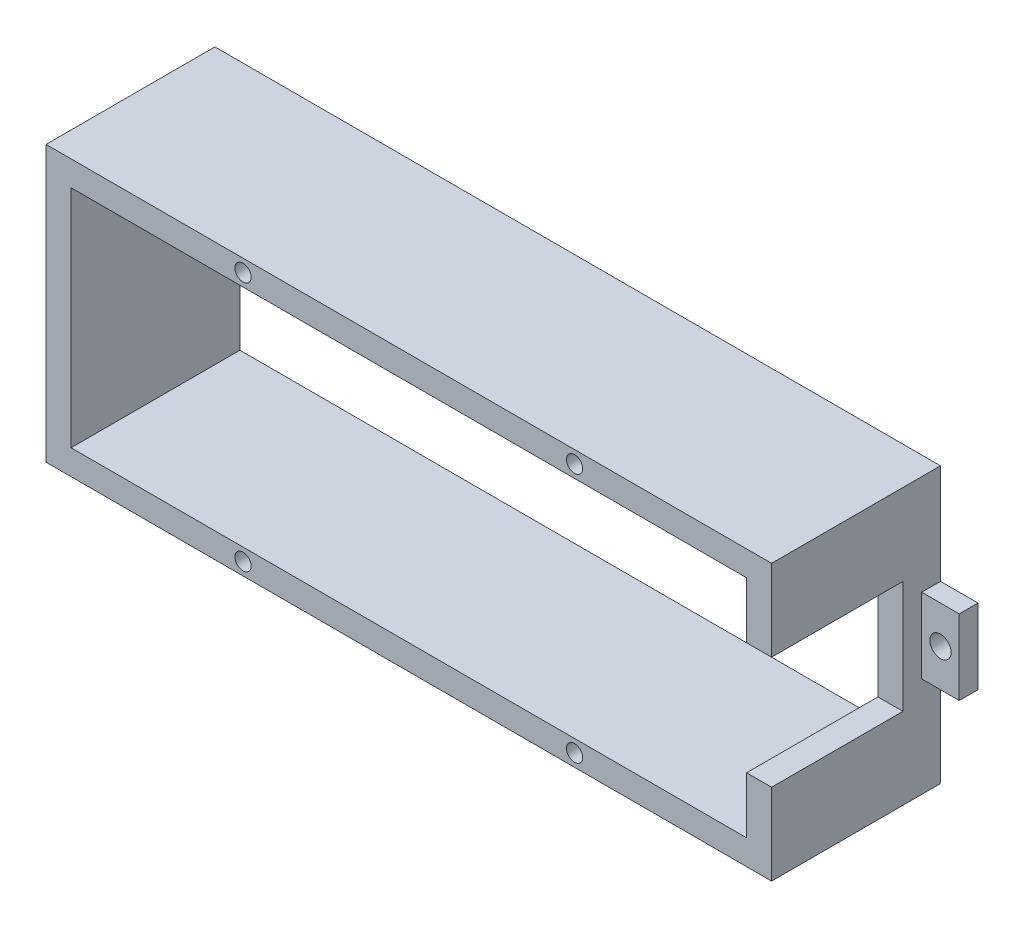
ISO-10303-21;
HEADER;
FILE_DESCRIPTION(('STEP AP214'),'2;1');
FILE_NAME('part.step','',(''),(''),'','','');
FILE_SCHEMA(('AUTOMOTIVE_DESIGN { 1 0 10303 214 1 1 1 1 }'));
ENDSEC;
DATA;
#1=APPLICATION_CONTEXT('core data for automotive mechanical design processes');
#2=APPLICATION_PROTOCOL_DEFINITION('international standard','automotive_design',2000,#1);
#3=PRODUCT_CONTEXT('',#1,'mechanical');
#4=PRODUCT('Part','Part','',(#3));
#5=PRODUCT_RELATED_PRODUCT_CATEGORY('part','',(#4));
#6=PRODUCT_DEFINITION_FORMATION('','',#4);
#7=PRODUCT_DEFINITION_CONTEXT('part definition',#1,'design');
#8=PRODUCT_DEFINITION('design','',#6,#7);
#9=PRODUCT_DEFINITION_SHAPE('','',#8);
#10=(LENGTH_UNIT() NAMED_UNIT(*) SI_UNIT(.MILLI.,.METRE.));
#11=(NAMED_UNIT(*) PLANE_ANGLE_UNIT() SI_UNIT($,.RADIAN.));
#12=(NAMED_UNIT(*) SI_UNIT($,.STERADIAN.) SOLID_ANGLE_UNIT());
#13=UNCERTAINTY_MEASURE_WITH_UNIT(LENGTH_MEASURE(1.E-05),#10,'distance_accuracy_value','');
#14=(GEOMETRIC_REPRESENTATION_CONTEXT(3) GLOBAL_UNCERTAINTY_ASSIGNED_CONTEXT((#13)) GLOBAL_UNIT_ASSIGNED_CONTEXT((#10,
#11,#12)) REPRESENTATION_CONTEXT('',''));
#15=CARTESIAN_POINT('',(0.,0.,0.));
#16=DIRECTION('',(0.,0.,1.));
#17=DIRECTION('',(1.,0.,0.));
#18=AXIS2_PLACEMENT_3D('',#15,#16,#17);
#19=CARTESIAN_POINT('',(58.,20.,87.));
#20=DIRECTION('',(-1.,0.,0.));
#21=DIRECTION('',(0.,0.,1.));
#22=AXIS2_PLACEMENT_3D('',#19,#20,#21);
#23=PLANE('',#22);
#24=DIRECTION('',(0.,0.,-1.));
#25=VECTOR('',#24,1.);
#26=CARTESIAN_POINT('',(58.,33.,87.));
#27=LINE('',#26,#25);
#28=CARTESIAN_POINT('',(58.,33.,87.));
#29=VERTEX_POINT('',#28);
#30=CARTESIAN_POINT('',(58.,33.,66.));
#31=VERTEX_POINT('',#30);
#32=EDGE_CURVE('E201',#29,#31,#27,.T.);
#33=ORIENTED_EDGE('',*,*,#32,.F.);
#34=DIRECTION('',(0.,1.,0.));
#35=VECTOR('',#34,1.);
#36=CARTESIAN_POINT('',(58.,20.,87.));
#37=LINE('',#36,#35);
#38=CARTESIAN_POINT('',(58.,20.,87.));
#39=VERTEX_POINT('',#38);
#40=EDGE_CURVE('E316',#39,#29,#37,.T.);
#41=ORIENTED_EDGE('',*,*,#40,.F.);
#42=DIRECTION('',(0.,0.,-1.));
#43=VECTOR('',#42,1.);
#44=CARTESIAN_POINT('',(58.,20.,87.));
#45=LINE('',#44,#43);
#46=CARTESIAN_POINT('',(58.,20.,60.));
#47=VERTEX_POINT('',#46);
#48=EDGE_CURVE('E339',#39,#47,#45,.T.);
#49=ORIENTED_EDGE('',*,*,#48,.T.);
#50=DIRECTION('',(0.,1.,0.));
#51=VECTOR('',#50,1.);
#52=CARTESIAN_POINT('',(58.,20.,60.));
#53=LINE('',#52,#51);
#54=CARTESIAN_POINT('',(58.,36.,60.));
#55=VERTEX_POINT('',#54);
#56=EDGE_CURVE('E327',#47,#55,#53,.T.);
#57=ORIENTED_EDGE('',*,*,#56,.T.);
#58=DIRECTION('',(0.,0.,-1.));
#59=VECTOR('',#58,1.);
#60=CARTESIAN_POINT('',(58.,36.,63.));
#61=LINE('',#60,#59);
#62=CARTESIAN_POINT('',(58.,36.,63.));
#63=VERTEX_POINT('',#62);
#64=EDGE_CURVE('E252',#63,#55,#61,.T.);
#65=ORIENTED_EDGE('',*,*,#64,.F.);
#66=DIRECTION('',(0.,-1.,0.));
#67=VECTOR('',#66,1.);
#68=CARTESIAN_POINT('',(58.,48.,63.));
#69=LINE('',#68,#67);
#70=CARTESIAN_POINT('',(58.,48.,63.));
#71=VERTEX_POINT('',#70);
#72=EDGE_CURVE('E229',#71,#63,#69,.T.);
#73=ORIENTED_EDGE('',*,*,#72,.F.);
#74=DIRECTION('',(0.,0.,-1.));
#75=VECTOR('',#74,1.);
#76=CARTESIAN_POINT('',(58.,48.,63.));
#77=LINE('',#76,#75);
#78=CARTESIAN_POINT('',(58.,48.,60.));
#79=VERTEX_POINT('',#78);
#80=EDGE_CURVE('E240',#71,#79,#77,.T.);
#81=ORIENTED_EDGE('',*,*,#80,.T.);
#82=CARTESIAN_POINT('',(58.,64.,60.));
#83=VERTEX_POINT('',#82);
#84=EDGE_CURVE('E330',#79,#83,#53,.T.);
#85=ORIENTED_EDGE('',*,*,#84,.T.);
#86=DIRECTION('',(0.,0.,-1.));
#87=VECTOR('',#86,1.);
#88=CARTESIAN_POINT('',(58.,64.,87.));
#89=LINE('',#88,#87);
#90=CARTESIAN_POINT('',(58.,64.,87.));
#91=VERTEX_POINT('',#90);
#92=EDGE_CURVE('E331',#91,#83,#89,.T.);
#93=ORIENTED_EDGE('',*,*,#92,.F.);
#94=CARTESIAN_POINT('',(58.,51.,87.));
#95=VERTEX_POINT('',#94);
#96=EDGE_CURVE('E198',#95,#91,#37,.T.);
#97=ORIENTED_EDGE('',*,*,#96,.F.);
#98=DIRECTION('',(0.,0.,1.));
#99=VECTOR('',#98,1.);
#100=CARTESIAN_POINT('',(58.,51.,87.));
#101=LINE('',#100,#99);
#102=CARTESIAN_POINT('',(58.,51.,66.));
#103=VERTEX_POINT('',#102);
#104=EDGE_CURVE('E190',#103,#95,#101,.T.);
#105=ORIENTED_EDGE('',*,*,#104,.F.);
#106=DIRECTION('',(0.,1.,0.));
#107=VECTOR('',#106,1.);
#108=CARTESIAN_POINT('',(58.,20.,66.));
#109=LINE('',#108,#107);
#110=EDGE_CURVE('E179',#31,#103,#109,.T.);
#111=ORIENTED_EDGE('',*,*,#110,.F.);
#112=EDGE_LOOP('',(#33,#41,#49,#57,#65,#73,#81,#85,#93,#97,#105,#111));
#113=FACE_BOUND('',#112,.T.);
#114=ADVANCED_FACE('F39',(#113),#23,.F.);
#115=CARTESIAN_POINT('',(0.,0.,87.));
#116=DIRECTION('',(0.,0.,1.));
#117=DIRECTION('',(1.,0.,0.));
#118=AXIS2_PLACEMENT_3D('',#115,#116,#117);
#119=PLANE('',#118);
#120=CARTESIAN_POINT('',(26.5,22.,87.));
#121=DIRECTION('',(0.,0.,1.));
#122=DIRECTION('',(1.,0.,0.));
#123=AXIS2_PLACEMENT_3D('',#120,#121,#122);
#124=CIRCLE('',#123,1.3);
#125=CARTESIAN_POINT('',(27.8,22.,87.));
#126=VERTEX_POINT('',#125);
#127=EDGE_CURVE('E345',#126,#126,#124,.F.);
#128=ORIENTED_EDGE('',*,*,#127,.T.);
#129=EDGE_LOOP('',(#128));
#130=FACE_BOUND('',#129,.T.);
#131=CARTESIAN_POINT('',(-26.5,62.,87.));
#132=DIRECTION('',(0.,0.,1.));
#133=DIRECTION('',(1.,0.,0.));
#134=AXIS2_PLACEMENT_3D('',#131,#132,#133);
#135=CIRCLE('',#134,1.3);
#136=CARTESIAN_POINT('',(-25.2,62.,87.));
#137=VERTEX_POINT('',#136);
#138=EDGE_CURVE('E352',#137,#137,#135,.F.);
#139=ORIENTED_EDGE('',*,*,#138,.T.);
#140=EDGE_LOOP('',(#139));
#141=FACE_BOUND('',#140,.T.);
#142=CARTESIAN_POINT('',(-26.5,22.,87.));
#143=DIRECTION('',(0.,0.,1.));
#144=DIRECTION('',(1.,0.,0.));
#145=AXIS2_PLACEMENT_3D('',#142,#143,#144);
#146=CIRCLE('',#145,1.3);
#147=CARTESIAN_POINT('',(-25.2,22.,87.));
#148=VERTEX_POINT('',#147);
#149=EDGE_CURVE('E348',#148,#148,#146,.F.);
#150=ORIENTED_EDGE('',*,*,#149,.T.);
#151=EDGE_LOOP('',(#150));
#152=FACE_BOUND('',#151,.T.);
#153=CARTESIAN_POINT('',(26.5,62.,87.));
#154=DIRECTION('',(0.,0.,1.));
#155=DIRECTION('',(1.,0.,0.));
#156=AXIS2_PLACEMENT_3D('',#153,#154,#155);
#157=CIRCLE('',#156,1.3);
#158=CARTESIAN_POINT('',(27.8,62.,87.));
#159=VERTEX_POINT('',#158);
#160=EDGE_CURVE('E220',#159,#159,#157,.F.);
#161=ORIENTED_EDGE('',*,*,#160,.T.);
#162=EDGE_LOOP('',(#161));
#163=FACE_BOUND('',#162,.T.);
#164=ORIENTED_EDGE('',*,*,#40,.T.);
#165=DIRECTION('',(-1.,0.,0.));
#166=VECTOR('',#165,1.);
#167=CARTESIAN_POINT('',(0.,33.,87.));
#168=LINE('',#167,#166);
#169=CARTESIAN_POINT('',(54.,33.,87.));
#170=VERTEX_POINT('',#169);
#171=EDGE_CURVE('E187',#29,#170,#168,.T.);
#172=ORIENTED_EDGE('',*,*,#171,.T.);
#173=DIRECTION('',(0.,1.,0.));
#174=VECTOR('',#173,1.);
#175=CARTESIAN_POINT('',(54.,24.,87.));
#176=LINE('',#175,#174);
#177=CARTESIAN_POINT('',(54.,24.,87.));
#178=VERTEX_POINT('',#177);
#179=EDGE_CURVE('E285',#178,#170,#176,.T.);
#180=ORIENTED_EDGE('',*,*,#179,.F.);
#181=DIRECTION('',(1.,0.,0.));
#182=VECTOR('',#181,1.);
#183=CARTESIAN_POINT('',(-54.,24.,87.));
#184=LINE('',#183,#182);
#185=CARTESIAN_POINT('',(-54.,24.,87.));
#186=VERTEX_POINT('',#185);
#187=EDGE_CURVE('E278',#186,#178,#184,.T.);
#188=ORIENTED_EDGE('',*,*,#187,.F.);
#189=DIRECTION('',(0.,-1.,0.));
#190=VECTOR('',#189,1.);
#191=CARTESIAN_POINT('',(-54.,60.,87.));
#192=LINE('',#191,#190);
#193=CARTESIAN_POINT('',(-54.,60.,87.));
#194=VERTEX_POINT('',#193);
#195=EDGE_CURVE('E279',#194,#186,#192,.T.);
#196=ORIENTED_EDGE('',*,*,#195,.F.);
#197=DIRECTION('',(-1.,0.,0.));
#198=VECTOR('',#197,1.);
#199=CARTESIAN_POINT('',(54.,60.,87.));
#200=LINE('',#199,#198);
#201=CARTESIAN_POINT('',(54.,60.,87.));
#202=VERTEX_POINT('',#201);
#203=EDGE_CURVE('E287',#202,#194,#200,.T.);
#204=ORIENTED_EDGE('',*,*,#203,.F.);
#205=CARTESIAN_POINT('',(54.,51.,87.));
#206=VERTEX_POINT('',#205);
#207=EDGE_CURVE('E282',#206,#202,#176,.T.);
#208=ORIENTED_EDGE('',*,*,#207,.F.);
#209=DIRECTION('',(1.,0.,0.));
#210=VECTOR('',#209,1.);
#211=CARTESIAN_POINT('',(0.,51.,87.));
#212=LINE('',#211,#210);
#213=EDGE_CURVE('E53',#206,#95,#212,.T.);
#214=ORIENTED_EDGE('',*,*,#213,.T.);
#215=ORIENTED_EDGE('',*,*,#96,.T.);
#216=DIRECTION('',(-1.,0.,0.));
#217=VECTOR('',#216,1.);
#218=CARTESIAN_POINT('',(58.,64.,87.));
#219=LINE('',#218,#217);
#220=CARTESIAN_POINT('',(-58.,64.,87.));
#221=VERTEX_POINT('',#220);
#222=EDGE_CURVE('E317',#91,#221,#219,.T.);
#223=ORIENTED_EDGE('',*,*,#222,.T.);
#224=DIRECTION('',(0.,-1.,0.));
#225=VECTOR('',#224,1.);
#226=CARTESIAN_POINT('',(-58.,64.,87.));
#227=LINE('',#226,#225);
#228=CARTESIAN_POINT('',(-58.,20.,87.));
#229=VERTEX_POINT('',#228);
#230=EDGE_CURVE('E309',#221,#229,#227,.T.);
#231=ORIENTED_EDGE('',*,*,#230,.T.);
#232=DIRECTION('',(1.,0.,0.));
#233=VECTOR('',#232,1.);
#234=CARTESIAN_POINT('',(-58.,20.,87.));
#235=LINE('',#234,#233);
#236=EDGE_CURVE('E311',#229,#39,#235,.T.);
#237=ORIENTED_EDGE('',*,*,#236,.T.);
#238=EDGE_LOOP('',(#164,#172,#180,#188,#196,#204,#208,#214,#215,#223,#231,#237));
#239=FACE_BOUND('',#238,.T.);
#240=ADVANCED_FACE('F364',(#130,#141,#152,#163,#239),#119,.T.);
#241=CARTESIAN_POINT('',(54.,24.,87.));
#242=DIRECTION('',(-1.,0.,0.));
#243=DIRECTION('',(0.,0.,1.));
#244=AXIS2_PLACEMENT_3D('',#241,#242,#243);
#245=PLANE('',#244);
#246=ORIENTED_EDGE('',*,*,#179,.T.);
#247=DIRECTION('',(0.,0.,-1.));
#248=VECTOR('',#247,1.);
#249=CARTESIAN_POINT('',(54.,33.,87.));
#250=LINE('',#249,#248);
#251=CARTESIAN_POINT('',(54.,33.,66.));
#252=VERTEX_POINT('',#251);
#253=EDGE_CURVE('E11',#170,#252,#250,.T.);
#254=ORIENTED_EDGE('',*,*,#253,.T.);
#255=DIRECTION('',(0.,1.,0.));
#256=VECTOR('',#255,1.);
#257=CARTESIAN_POINT('',(54.,24.,66.));
#258=LINE('',#257,#256);
#259=CARTESIAN_POINT('',(54.,51.,66.));
#260=VERTEX_POINT('',#259);
#261=EDGE_CURVE('E50',#252,#260,#258,.T.);
#262=ORIENTED_EDGE('',*,*,#261,.T.);
#263=DIRECTION('',(0.,0.,1.));
#264=VECTOR('',#263,1.);
#265=CARTESIAN_POINT('',(54.,51.,87.));
#266=LINE('',#265,#264);
#267=EDGE_CURVE('E192',#260,#206,#266,.T.);
#268=ORIENTED_EDGE('',*,*,#267,.T.);
#269=ORIENTED_EDGE('',*,*,#207,.T.);
#270=DIRECTION('',(0.,0.,-1.));
#271=VECTOR('',#270,1.);
#272=CARTESIAN_POINT('',(54.,60.,87.));
#273=LINE('',#272,#271);
#274=CARTESIAN_POINT('',(54.,60.,60.));
#275=VERTEX_POINT('',#274);
#276=EDGE_CURVE('E302',#202,#275,#273,.T.);
#277=ORIENTED_EDGE('',*,*,#276,.T.);
#278=DIRECTION('',(0.,1.,0.));
#279=VECTOR('',#278,1.);
#280=CARTESIAN_POINT('',(54.,24.,60.));
#281=LINE('',#280,#279);
#282=CARTESIAN_POINT('',(54.,24.,60.));
#283=VERTEX_POINT('',#282);
#284=EDGE_CURVE('E293',#283,#275,#281,.T.);
#285=ORIENTED_EDGE('',*,*,#284,.F.);
#286=DIRECTION('',(0.,0.,-1.));
#287=VECTOR('',#286,1.);
#288=CARTESIAN_POINT('',(54.,24.,87.));
#289=LINE('',#288,#287);
#290=EDGE_CURVE('E303',#178,#283,#289,.T.);
#291=ORIENTED_EDGE('',*,*,#290,.F.);
#292=EDGE_LOOP('',(#246,#254,#262,#268,#269,#277,#285,#291));
#293=FACE_BOUND('',#292,.T.);
#294=ADVANCED_FACE('F358',(#293),#245,.T.);
#295=CARTESIAN_POINT('',(-58.,64.,87.));
#296=DIRECTION('',(1.,0.,0.));
#297=DIRECTION('',(0.,0.,-1.));
#298=AXIS2_PLACEMENT_3D('',#295,#296,#297);
#299=PLANE('',#298);
#300=DIRECTION('',(0.,0.,-1.));
#301=VECTOR('',#300,1.);
#302=CARTESIAN_POINT('',(-58.,48.,63.));
#303=LINE('',#302,#301);
#304=CARTESIAN_POINT('',(-58.,48.,63.));
#305=VERTEX_POINT('',#304);
#306=CARTESIAN_POINT('',(-58.,48.,60.));
#307=VERTEX_POINT('',#306);
#308=EDGE_CURVE('E259',#305,#307,#303,.T.);
#309=ORIENTED_EDGE('',*,*,#308,.F.);
#310=DIRECTION('',(0.,1.,0.));
#311=VECTOR('',#310,1.);
#312=CARTESIAN_POINT('',(-58.,36.,63.));
#313=LINE('',#312,#311);
#314=CARTESIAN_POINT('',(-58.,36.,63.));
#315=VERTEX_POINT('',#314);
#316=EDGE_CURVE('E275',#315,#305,#313,.T.);
#317=ORIENTED_EDGE('',*,*,#316,.F.);
#318=DIRECTION('',(0.,0.,-1.));
#319=VECTOR('',#318,1.);
#320=CARTESIAN_POINT('',(-58.,36.,63.));
#321=LINE('',#320,#319);
#322=CARTESIAN_POINT('',(-58.,36.,60.));
#323=VERTEX_POINT('',#322);
#324=EDGE_CURVE('E260',#315,#323,#321,.T.);
#325=ORIENTED_EDGE('',*,*,#324,.T.);
#326=DIRECTION('',(0.,-1.,0.));
#327=VECTOR('',#326,1.);
#328=CARTESIAN_POINT('',(-58.,64.,60.));
#329=LINE('',#328,#327);
#330=CARTESIAN_POINT('',(-58.,20.,60.));
#331=VERTEX_POINT('',#330);
#332=EDGE_CURVE('E310',#323,#331,#329,.T.);
#333=ORIENTED_EDGE('',*,*,#332,.T.);
#334=DIRECTION('',(0.,0.,-1.));
#335=VECTOR('',#334,1.);
#336=CARTESIAN_POINT('',(-58.,20.,87.));
#337=LINE('',#336,#335);
#338=EDGE_CURVE('E336',#229,#331,#337,.T.);
#339=ORIENTED_EDGE('',*,*,#338,.F.);
#340=ORIENTED_EDGE('',*,*,#230,.F.);
#341=DIRECTION('',(0.,0.,-1.));
#342=VECTOR('',#341,1.);
#343=CARTESIAN_POINT('',(-58.,64.,87.));
#344=LINE('',#343,#342);
#345=CARTESIAN_POINT('',(-58.,64.,60.));
#346=VERTEX_POINT('',#345);
#347=EDGE_CURVE('E321',#221,#346,#344,.T.);
#348=ORIENTED_EDGE('',*,*,#347,.T.);
#349=EDGE_CURVE('E325',#346,#307,#329,.T.);
#350=ORIENTED_EDGE('',*,*,#349,.T.);
#351=EDGE_LOOP('',(#309,#317,#325,#333,#339,#340,#348,#350));
#352=FACE_BOUND('',#351,.T.);
#353=ADVANCED_FACE('F41',(#352),#299,.F.);
#354=CARTESIAN_POINT('',(0.,0.,60.));
#355=DIRECTION('',(0.,0.,1.));
#356=DIRECTION('',(1.,0.,0.));
#357=AXIS2_PLACEMENT_3D('',#354,#355,#356);
#358=PLANE('',#357);
#359=CARTESIAN_POINT('',(61.,42.,60.));
#360=DIRECTION('',(0.,0.,1.));
#361=DIRECTION('',(1.,0.,0.));
#362=AXIS2_PLACEMENT_3D('',#359,#360,#361);
#363=CIRCLE('',#362,1.69999999999999);
#364=CARTESIAN_POINT('',(62.7,42.,60.));
#365=VERTEX_POINT('',#364);
#366=EDGE_CURVE('E224',#365,#365,#363,.F.);
#367=ORIENTED_EDGE('',*,*,#366,.F.);
#368=EDGE_LOOP('',(#367));
#369=FACE_BOUND('',#368,.T.);
#370=CARTESIAN_POINT('',(-61.,42.,60.));
#371=DIRECTION('',(0.,0.,1.));
#372=DIRECTION('',(1.,0.,0.));
#373=AXIS2_PLACEMENT_3D('',#370,#371,#372);
#374=CIRCLE('',#373,1.7);
#375=CARTESIAN_POINT('',(-59.3,42.,60.));
#376=VERTEX_POINT('',#375);
#377=EDGE_CURVE('E217',#376,#376,#374,.F.);
#378=ORIENTED_EDGE('',*,*,#377,.F.);
#379=EDGE_LOOP('',(#378));
#380=FACE_BOUND('',#379,.T.);
#381=ORIENTED_EDGE('',*,*,#349,.F.);
#382=DIRECTION('',(-1.,0.,0.));
#383=VECTOR('',#382,1.);
#384=CARTESIAN_POINT('',(58.,64.,60.));
#385=LINE('',#384,#383);
#386=EDGE_CURVE('E314',#83,#346,#385,.T.);
#387=ORIENTED_EDGE('',*,*,#386,.F.);
#388=ORIENTED_EDGE('',*,*,#84,.F.);
#389=DIRECTION('',(-1.,0.,0.));
#390=VECTOR('',#389,1.);
#391=CARTESIAN_POINT('',(64.,48.,60.));
#392=LINE('',#391,#390);
#393=CARTESIAN_POINT('',(64.,48.,60.));
#394=VERTEX_POINT('',#393);
#395=EDGE_CURVE('E231',#394,#79,#392,.T.);
#396=ORIENTED_EDGE('',*,*,#395,.F.);
#397=DIRECTION('',(0.,1.,0.));
#398=VECTOR('',#397,1.);
#399=CARTESIAN_POINT('',(64.,36.,60.));
#400=LINE('',#399,#398);
#401=CARTESIAN_POINT('',(64.,36.,60.));
#402=VERTEX_POINT('',#401);
#403=EDGE_CURVE('E238',#402,#394,#400,.T.);
#404=ORIENTED_EDGE('',*,*,#403,.F.);
#405=DIRECTION('',(1.,0.,0.));
#406=VECTOR('',#405,1.);
#407=CARTESIAN_POINT('',(58.,36.,60.));
#408=LINE('',#407,#406);
#409=EDGE_CURVE('E236',#55,#402,#408,.T.);
#410=ORIENTED_EDGE('',*,*,#409,.F.);
#411=ORIENTED_EDGE('',*,*,#56,.F.);
#412=DIRECTION('',(1.,0.,0.));
#413=VECTOR('',#412,1.);
#414=CARTESIAN_POINT('',(-58.,20.,60.));
#415=LINE('',#414,#413);
#416=EDGE_CURVE('E324',#331,#47,#415,.T.);
#417=ORIENTED_EDGE('',*,*,#416,.F.);
#418=ORIENTED_EDGE('',*,*,#332,.F.);
#419=DIRECTION('',(1.,0.,0.));
#420=VECTOR('',#419,1.);
#421=CARTESIAN_POINT('',(-64.,36.,60.));
#422=LINE('',#421,#420);
#423=CARTESIAN_POINT('',(-64.,36.,60.));
#424=VERTEX_POINT('',#423);
#425=EDGE_CURVE('E64',#424,#323,#422,.T.);
#426=ORIENTED_EDGE('',*,*,#425,.F.);
#427=DIRECTION('',(0.,-1.,0.));
#428=VECTOR('',#427,1.);
#429=CARTESIAN_POINT('',(-64.,48.,60.));
#430=LINE('',#429,#428);
#431=CARTESIAN_POINT('',(-64.,48.,60.));
#432=VERTEX_POINT('',#431);
#433=EDGE_CURVE('E243',#432,#424,#430,.T.);
#434=ORIENTED_EDGE('',*,*,#433,.F.);
#435=DIRECTION('',(-1.,0.,0.));
#436=VECTOR('',#435,1.);
#437=CARTESIAN_POINT('',(-58.,48.,60.));
#438=LINE('',#437,#436);
#439=EDGE_CURVE('E264',#307,#432,#438,.T.);
#440=ORIENTED_EDGE('',*,*,#439,.F.);
#441=EDGE_LOOP('',(#381,#387,#388,#396,#404,#410,#411,#417,#418,#426,#434,#440));
#442=FACE_BOUND('',#441,.T.);
#443=DIRECTION('',(0.,-1.,0.));
#444=VECTOR('',#443,1.);
#445=CARTESIAN_POINT('',(-54.,60.,60.));
#446=LINE('',#445,#444);
#447=CARTESIAN_POINT('',(-54.,60.,60.));
#448=VERTEX_POINT('',#447);
#449=CARTESIAN_POINT('',(-54.,24.,60.));
#450=VERTEX_POINT('',#449);
#451=EDGE_CURVE('E254',#448,#450,#446,.T.);
#452=ORIENTED_EDGE('',*,*,#451,.T.);
#453=DIRECTION('',(1.,0.,0.));
#454=VECTOR('',#453,1.);
#455=CARTESIAN_POINT('',(-54.,24.,60.));
#456=LINE('',#455,#454);
#457=EDGE_CURVE('E295',#450,#283,#456,.T.);
#458=ORIENTED_EDGE('',*,*,#457,.T.);
#459=ORIENTED_EDGE('',*,*,#284,.T.);
#460=DIRECTION('',(-1.,0.,0.));
#461=VECTOR('',#460,1.);
#462=CARTESIAN_POINT('',(54.,60.,60.));
#463=LINE('',#462,#461);
#464=EDGE_CURVE('E283',#275,#448,#463,.T.);
#465=ORIENTED_EDGE('',*,*,#464,.T.);
#466=EDGE_LOOP('',(#452,#458,#459,#465));
#467=FACE_BOUND('',#466,.T.);
#468=ADVANCED_FACE('F380',(#369,#380,#442,#467),#358,.F.);
#469=CARTESIAN_POINT('',(-58.,20.,87.));
#470=DIRECTION('',(0.,1.,0.));
#471=DIRECTION('',(0.,0.,1.));
#472=AXIS2_PLACEMENT_3D('',#469,#470,#471);
#473=PLANE('',#472);
#474=ORIENTED_EDGE('',*,*,#48,.F.);
#475=ORIENTED_EDGE('',*,*,#236,.F.);
#476=ORIENTED_EDGE('',*,*,#338,.T.);
#477=ORIENTED_EDGE('',*,*,#416,.T.);
#478=EDGE_LOOP('',(#474,#475,#476,#477));
#479=FACE_BOUND('',#478,.T.);
#480=ADVANCED_FACE('F371',(#479),#473,.F.);
#481=CARTESIAN_POINT('',(58.,64.,87.));
#482=DIRECTION('',(0.,-1.,0.));
#483=DIRECTION('',(0.,0.,-1.));
#484=AXIS2_PLACEMENT_3D('',#481,#482,#483);
#485=PLANE('',#484);
#486=ORIENTED_EDGE('',*,*,#347,.F.);
#487=ORIENTED_EDGE('',*,*,#222,.F.);
#488=ORIENTED_EDGE('',*,*,#92,.T.);
#489=ORIENTED_EDGE('',*,*,#386,.T.);
#490=EDGE_LOOP('',(#486,#487,#488,#489));
#491=FACE_BOUND('',#490,.T.);
#492=ADVANCED_FACE('F398',(#491),#485,.F.);
#493=CARTESIAN_POINT('',(-54.,60.,87.));
#494=DIRECTION('',(1.,0.,0.));
#495=DIRECTION('',(0.,0.,-1.));
#496=AXIS2_PLACEMENT_3D('',#493,#494,#495);
#497=PLANE('',#496);
#498=ORIENTED_EDGE('',*,*,#451,.F.);
#499=DIRECTION('',(0.,0.,-1.));
#500=VECTOR('',#499,1.);
#501=CARTESIAN_POINT('',(-54.,60.,87.));
#502=LINE('',#501,#500);
#503=EDGE_CURVE('E288',#194,#448,#502,.T.);
#504=ORIENTED_EDGE('',*,*,#503,.F.);
#505=ORIENTED_EDGE('',*,*,#195,.T.);
#506=DIRECTION('',(0.,0.,-1.));
#507=VECTOR('',#506,1.);
#508=CARTESIAN_POINT('',(-54.,24.,87.));
#509=LINE('',#508,#507);
#510=EDGE_CURVE('E308',#186,#450,#509,.T.);
#511=ORIENTED_EDGE('',*,*,#510,.T.);
#512=EDGE_LOOP('',(#498,#504,#505,#511));
#513=FACE_BOUND('',#512,.T.);
#514=ADVANCED_FACE('F413',(#513),#497,.T.);
#515=CARTESIAN_POINT('',(-54.,24.,87.));
#516=DIRECTION('',(0.,1.,0.));
#517=DIRECTION('',(0.,0.,1.));
#518=AXIS2_PLACEMENT_3D('',#515,#516,#517);
#519=PLANE('',#518);
#520=ORIENTED_EDGE('',*,*,#187,.T.);
#521=ORIENTED_EDGE('',*,*,#290,.T.);
#522=ORIENTED_EDGE('',*,*,#457,.F.);
#523=ORIENTED_EDGE('',*,*,#510,.F.);
#524=EDGE_LOOP('',(#520,#521,#522,#523));
#525=FACE_BOUND('',#524,.T.);
#526=ADVANCED_FACE('F412',(#525),#519,.T.);
#527=CARTESIAN_POINT('',(54.,60.,87.));
#528=DIRECTION('',(0.,-1.,0.));
#529=DIRECTION('',(0.,0.,-1.));
#530=AXIS2_PLACEMENT_3D('',#527,#528,#529);
#531=PLANE('',#530);
#532=ORIENTED_EDGE('',*,*,#203,.T.);
#533=ORIENTED_EDGE('',*,*,#503,.T.);
#534=ORIENTED_EDGE('',*,*,#464,.F.);
#535=ORIENTED_EDGE('',*,*,#276,.F.);
#536=EDGE_LOOP('',(#532,#533,#534,#535));
#537=FACE_BOUND('',#536,.T.);
#538=ADVANCED_FACE('F408',(#537),#531,.T.);
#539=CARTESIAN_POINT('',(58.,36.,63.));
#540=DIRECTION('',(0.,1.,0.));
#541=DIRECTION('',(0.,0.,1.));
#542=AXIS2_PLACEMENT_3D('',#539,#540,#541);
#543=PLANE('',#542);
#544=ORIENTED_EDGE('',*,*,#409,.T.);
#545=DIRECTION('',(0.,0.,-1.));
#546=VECTOR('',#545,1.);
#547=CARTESIAN_POINT('',(64.,36.,63.));
#548=LINE('',#547,#546);
#549=CARTESIAN_POINT('',(64.,36.,63.));
#550=VERTEX_POINT('',#549);
#551=EDGE_CURVE('E248',#550,#402,#548,.T.);
#552=ORIENTED_EDGE('',*,*,#551,.F.);
#553=DIRECTION('',(1.,0.,0.));
#554=VECTOR('',#553,1.);
#555=CARTESIAN_POINT('',(58.,36.,63.));
#556=LINE('',#555,#554);
#557=EDGE_CURVE('E226',#63,#550,#556,.T.);
#558=ORIENTED_EDGE('',*,*,#557,.F.);
#559=ORIENTED_EDGE('',*,*,#64,.T.);
#560=EDGE_LOOP('',(#544,#552,#558,#559));
#561=FACE_BOUND('',#560,.T.);
#562=ADVANCED_FACE('F383',(#561),#543,.F.);
#563=CARTESIAN_POINT('',(64.,36.,63.));
#564=DIRECTION('',(-1.,0.,0.));
#565=DIRECTION('',(0.,0.,1.));
#566=AXIS2_PLACEMENT_3D('',#563,#564,#565);
#567=PLANE('',#566);
#568=ORIENTED_EDGE('',*,*,#403,.T.);
#569=DIRECTION('',(0.,0.,-1.));
#570=VECTOR('',#569,1.);
#571=CARTESIAN_POINT('',(64.,48.,63.));
#572=LINE('',#571,#570);
#573=CARTESIAN_POINT('',(64.,48.,63.));
#574=VERTEX_POINT('',#573);
#575=EDGE_CURVE('E246',#574,#394,#572,.T.);
#576=ORIENTED_EDGE('',*,*,#575,.F.);
#577=DIRECTION('',(0.,1.,0.));
#578=VECTOR('',#577,1.);
#579=CARTESIAN_POINT('',(64.,36.,63.));
#580=LINE('',#579,#578);
#581=EDGE_CURVE('E234',#550,#574,#580,.T.);
#582=ORIENTED_EDGE('',*,*,#581,.F.);
#583=ORIENTED_EDGE('',*,*,#551,.T.);
#584=EDGE_LOOP('',(#568,#576,#582,#583));
#585=FACE_BOUND('',#584,.T.);
#586=ADVANCED_FACE('F473',(#585),#567,.F.);
#587=CARTESIAN_POINT('',(64.,48.,63.));
#588=DIRECTION('',(0.,-1.,0.));
#589=DIRECTION('',(0.,0.,-1.));
#590=AXIS2_PLACEMENT_3D('',#587,#588,#589);
#591=PLANE('',#590);
#592=ORIENTED_EDGE('',*,*,#395,.T.);
#593=ORIENTED_EDGE('',*,*,#80,.F.);
#594=DIRECTION('',(-1.,0.,0.));
#595=VECTOR('',#594,1.);
#596=CARTESIAN_POINT('',(64.,48.,63.));
#597=LINE('',#596,#595);
#598=EDGE_CURVE('E235',#574,#71,#597,.T.);
#599=ORIENTED_EDGE('',*,*,#598,.F.);
#600=ORIENTED_EDGE('',*,*,#575,.T.);
#601=EDGE_LOOP('',(#592,#593,#599,#600));
#602=FACE_BOUND('',#601,.T.);
#603=ADVANCED_FACE('F395',(#602),#591,.F.);
#604=CARTESIAN_POINT('',(0.,0.,63.));
#605=DIRECTION('',(0.,0.,1.));
#606=DIRECTION('',(1.,0.,0.));
#607=AXIS2_PLACEMENT_3D('',#604,#605,#606);
#608=PLANE('',#607);
#609=CARTESIAN_POINT('',(61.,42.,63.));
#610=DIRECTION('',(0.,0.,1.));
#611=DIRECTION('',(1.,0.,0.));
#612=AXIS2_PLACEMENT_3D('',#609,#610,#611);
#613=CIRCLE('',#612,1.69999999999999);
#614=CARTESIAN_POINT('',(62.7,42.,63.));
#615=VERTEX_POINT('',#614);
#616=EDGE_CURVE('E222',#615,#615,#613,.F.);
#617=ORIENTED_EDGE('',*,*,#616,.T.);
#618=EDGE_LOOP('',(#617));
#619=FACE_BOUND('',#618,.T.);
#620=ORIENTED_EDGE('',*,*,#72,.T.);
#621=ORIENTED_EDGE('',*,*,#557,.T.);
#622=ORIENTED_EDGE('',*,*,#581,.T.);
#623=ORIENTED_EDGE('',*,*,#598,.T.);
#624=EDGE_LOOP('',(#620,#621,#622,#623));
#625=FACE_BOUND('',#624,.T.);
#626=ADVANCED_FACE('F386',(#619,#625),#608,.T.);
#627=CARTESIAN_POINT('',(-64.,48.,63.));
#628=DIRECTION('',(1.,0.,0.));
#629=DIRECTION('',(0.,0.,-1.));
#630=AXIS2_PLACEMENT_3D('',#627,#628,#629);
#631=PLANE('',#630);
#632=ORIENTED_EDGE('',*,*,#433,.T.);
#633=DIRECTION('',(0.,0.,-1.));
#634=VECTOR('',#633,1.);
#635=CARTESIAN_POINT('',(-64.,36.,63.));
#636=LINE('',#635,#634);
#637=CARTESIAN_POINT('',(-64.,36.,63.));
#638=VERTEX_POINT('',#637);
#639=EDGE_CURVE('E228',#638,#424,#636,.T.);
#640=ORIENTED_EDGE('',*,*,#639,.F.);
#641=DIRECTION('',(0.,-1.,0.));
#642=VECTOR('',#641,1.);
#643=CARTESIAN_POINT('',(-64.,48.,63.));
#644=LINE('',#643,#642);
#645=CARTESIAN_POINT('',(-64.,48.,63.));
#646=VERTEX_POINT('',#645);
#647=EDGE_CURVE('E270',#646,#638,#644,.T.);
#648=ORIENTED_EDGE('',*,*,#647,.F.);
#649=DIRECTION('',(0.,0.,-1.));
#650=VECTOR('',#649,1.);
#651=CARTESIAN_POINT('',(-64.,48.,63.));
#652=LINE('',#651,#650);
#653=EDGE_CURVE('E261',#646,#432,#652,.T.);
#654=ORIENTED_EDGE('',*,*,#653,.T.);
#655=EDGE_LOOP('',(#632,#640,#648,#654));
#656=FACE_BOUND('',#655,.T.);
#657=ADVANCED_FACE('F467',(#656),#631,.F.);
#658=CARTESIAN_POINT('',(-64.,36.,63.));
#659=DIRECTION('',(0.,1.,0.));
#660=DIRECTION('',(0.,0.,1.));
#661=AXIS2_PLACEMENT_3D('',#658,#659,#660);
#662=PLANE('',#661);
#663=ORIENTED_EDGE('',*,*,#425,.T.);
#664=ORIENTED_EDGE('',*,*,#324,.F.);
#665=DIRECTION('',(1.,0.,0.));
#666=VECTOR('',#665,1.);
#667=CARTESIAN_POINT('',(-64.,36.,63.));
#668=LINE('',#667,#666);
#669=EDGE_CURVE('E273',#638,#315,#668,.T.);
#670=ORIENTED_EDGE('',*,*,#669,.F.);
#671=ORIENTED_EDGE('',*,*,#639,.T.);
#672=EDGE_LOOP('',(#663,#664,#670,#671));
#673=FACE_BOUND('',#672,.T.);
#674=ADVANCED_FACE('F479',(#673),#662,.F.);
#675=CARTESIAN_POINT('',(-58.,48.,63.));
#676=DIRECTION('',(0.,-1.,0.));
#677=DIRECTION('',(0.,0.,-1.));
#678=AXIS2_PLACEMENT_3D('',#675,#676,#677);
#679=PLANE('',#678);
#680=ORIENTED_EDGE('',*,*,#439,.T.);
#681=ORIENTED_EDGE('',*,*,#653,.F.);
#682=DIRECTION('',(-1.,0.,0.));
#683=VECTOR('',#682,1.);
#684=CARTESIAN_POINT('',(-58.,48.,63.));
#685=LINE('',#684,#683);
#686=EDGE_CURVE('E262',#305,#646,#685,.T.);
#687=ORIENTED_EDGE('',*,*,#686,.F.);
#688=ORIENTED_EDGE('',*,*,#308,.T.);
#689=EDGE_LOOP('',(#680,#681,#687,#688));
#690=FACE_BOUND('',#689,.T.);
#691=ADVANCED_FACE('F458',(#690),#679,.F.);
#692=CARTESIAN_POINT('',(0.,0.,63.));
#693=DIRECTION('',(0.,0.,1.));
#694=DIRECTION('',(1.,0.,0.));
#695=AXIS2_PLACEMENT_3D('',#692,#693,#694);
#696=PLANE('',#695);
#697=CARTESIAN_POINT('',(-61.,42.,63.));
#698=DIRECTION('',(0.,0.,1.));
#699=DIRECTION('',(1.,0.,0.));
#700=AXIS2_PLACEMENT_3D('',#697,#698,#699);
#701=CIRCLE('',#700,1.7);
#702=CARTESIAN_POINT('',(-59.3,42.,63.));
#703=VERTEX_POINT('',#702);
#704=EDGE_CURVE('E225',#703,#703,#701,.F.);
#705=ORIENTED_EDGE('',*,*,#704,.T.);
#706=EDGE_LOOP('',(#705));
#707=FACE_BOUND('',#706,.T.);
#708=ORIENTED_EDGE('',*,*,#647,.T.);
#709=ORIENTED_EDGE('',*,*,#669,.T.);
#710=ORIENTED_EDGE('',*,*,#316,.T.);
#711=ORIENTED_EDGE('',*,*,#686,.T.);
#712=EDGE_LOOP('',(#708,#709,#710,#711));
#713=FACE_BOUND('',#712,.T.);
#714=ADVANCED_FACE('F451',(#707,#713),#696,.T.);
#715=CARTESIAN_POINT('',(-61.,42.,64.));
#716=DIRECTION('',(0.,0.,-1.));
#717=DIRECTION('',(-1.,0.,0.));
#718=AXIS2_PLACEMENT_3D('',#715,#716,#717);
#719=CYLINDRICAL_SURFACE('',#718,1.7);
#720=ORIENTED_EDGE('',*,*,#704,.F.);
#721=EDGE_LOOP('',(#720));
#722=FACE_BOUND('',#721,.T.);
#723=ORIENTED_EDGE('',*,*,#377,.T.);
#724=EDGE_LOOP('',(#723));
#725=FACE_BOUND('',#724,.T.);
#726=ADVANCED_FACE('F447',(#722,#725),#719,.F.);
#727=CARTESIAN_POINT('',(61.,42.,64.));
#728=DIRECTION('',(0.,0.,-1.));
#729=DIRECTION('',(-1.,0.,0.));
#730=AXIS2_PLACEMENT_3D('',#727,#728,#729);
#731=CYLINDRICAL_SURFACE('',#730,1.69999999999999);
#732=ORIENTED_EDGE('',*,*,#616,.F.);
#733=EDGE_LOOP('',(#732));
#734=FACE_BOUND('',#733,.T.);
#735=ORIENTED_EDGE('',*,*,#366,.T.);
#736=EDGE_LOOP('',(#735));
#737=FACE_BOUND('',#736,.T.);
#738=ADVANCED_FACE('F446',(#734,#737),#731,.F.);
#739=CARTESIAN_POINT('',(26.5,62.,88.));
#740=DIRECTION('',(0.,0.,-1.));
#741=DIRECTION('',(-1.,0.,0.));
#742=AXIS2_PLACEMENT_3D('',#739,#740,#741);
#743=CYLINDRICAL_SURFACE('',#742,1.3);
#744=ORIENTED_EDGE('',*,*,#160,.F.);
#745=EDGE_LOOP('',(#744));
#746=FACE_BOUND('',#745,.T.);
#747=CARTESIAN_POINT('',(26.5,62.,79.));
#748=DIRECTION('',(0.,0.,1.));
#749=DIRECTION('',(1.,0.,0.));
#750=AXIS2_PLACEMENT_3D('',#747,#748,#749);
#751=CIRCLE('',#750,1.3);
#752=CARTESIAN_POINT('',(27.8,62.,79.));
#753=VERTEX_POINT('',#752);
#754=EDGE_CURVE('E215',#753,#753,#751,.T.);
#755=ORIENTED_EDGE('',*,*,#754,.F.);
#756=EDGE_LOOP('',(#755));
#757=FACE_BOUND('',#756,.T.);
#758=ADVANCED_FACE('F460',(#746,#757),#743,.F.);
#759=CARTESIAN_POINT('',(26.5,62.,79.));
#760=DIRECTION('',(0.,0.,1.));
#761=DIRECTION('',(1.,0.,0.));
#762=AXIS2_PLACEMENT_3D('',#759,#760,#761);
#763=PLANE('',#762);
#764=ORIENTED_EDGE('',*,*,#754,.T.);
#765=EDGE_LOOP('',(#764));
#766=FACE_BOUND('',#765,.T.);
#767=ADVANCED_FACE('F585',(#766),#763,.T.);
#768=CARTESIAN_POINT('',(-26.5,22.,88.));
#769=DIRECTION('',(0.,0.,-1.));
#770=DIRECTION('',(-1.,0.,0.));
#771=AXIS2_PLACEMENT_3D('',#768,#769,#770);
#772=CYLINDRICAL_SURFACE('',#771,1.3);
#773=ORIENTED_EDGE('',*,*,#149,.F.);
#774=EDGE_LOOP('',(#773));
#775=FACE_BOUND('',#774,.T.);
#776=CARTESIAN_POINT('',(-26.5,22.,79.));
#777=DIRECTION('',(0.,0.,1.));
#778=DIRECTION('',(1.,0.,0.));
#779=AXIS2_PLACEMENT_3D('',#776,#777,#778);
#780=CIRCLE('',#779,1.3);
#781=CARTESIAN_POINT('',(-25.2,22.,79.));
#782=VERTEX_POINT('',#781);
#783=EDGE_CURVE('E202',#782,#782,#780,.T.);
#784=ORIENTED_EDGE('',*,*,#783,.F.);
#785=EDGE_LOOP('',(#784));
#786=FACE_BOUND('',#785,.T.);
#787=ADVANCED_FACE('F575',(#775,#786),#772,.F.);
#788=CARTESIAN_POINT('',(-26.5,22.,79.));
#789=DIRECTION('',(0.,0.,1.));
#790=DIRECTION('',(1.,0.,0.));
#791=AXIS2_PLACEMENT_3D('',#788,#789,#790);
#792=PLANE('',#791);
#793=ORIENTED_EDGE('',*,*,#783,.T.);
#794=EDGE_LOOP('',(#793));
#795=FACE_BOUND('',#794,.T.);
#796=ADVANCED_FACE('F563',(#795),#792,.T.);
#797=CARTESIAN_POINT('',(-26.5,62.,88.));
#798=DIRECTION('',(0.,0.,-1.));
#799=DIRECTION('',(-1.,0.,0.));
#800=AXIS2_PLACEMENT_3D('',#797,#798,#799);
#801=CYLINDRICAL_SURFACE('',#800,1.3);
#802=ORIENTED_EDGE('',*,*,#138,.F.);
#803=EDGE_LOOP('',(#802));
#804=FACE_BOUND('',#803,.T.);
#805=CARTESIAN_POINT('',(-26.5,62.,79.));
#806=DIRECTION('',(0.,0.,1.));
#807=DIRECTION('',(1.,0.,0.));
#808=AXIS2_PLACEMENT_3D('',#805,#806,#807);
#809=CIRCLE('',#808,1.3);
#810=CARTESIAN_POINT('',(-25.2,62.,79.));
#811=VERTEX_POINT('',#810);
#812=EDGE_CURVE('E208',#811,#811,#809,.T.);
#813=ORIENTED_EDGE('',*,*,#812,.F.);
#814=EDGE_LOOP('',(#813));
#815=FACE_BOUND('',#814,.T.);
#816=ADVANCED_FACE('F551',(#804,#815),#801,.F.);
#817=CARTESIAN_POINT('',(-26.5,62.,79.));
#818=DIRECTION('',(0.,0.,1.));
#819=DIRECTION('',(1.,0.,0.));
#820=AXIS2_PLACEMENT_3D('',#817,#818,#819);
#821=PLANE('',#820);
#822=ORIENTED_EDGE('',*,*,#812,.T.);
#823=EDGE_LOOP('',(#822));
#824=FACE_BOUND('',#823,.T.);
#825=ADVANCED_FACE('F542',(#824),#821,.T.);
#826=CARTESIAN_POINT('',(26.5,22.,88.));
#827=DIRECTION('',(0.,0.,-1.));
#828=DIRECTION('',(-1.,0.,0.));
#829=AXIS2_PLACEMENT_3D('',#826,#827,#828);
#830=CYLINDRICAL_SURFACE('',#829,1.3);
#831=ORIENTED_EDGE('',*,*,#127,.F.);
#832=EDGE_LOOP('',(#831));
#833=FACE_BOUND('',#832,.T.);
#834=CARTESIAN_POINT('',(26.5,22.,79.));
#835=DIRECTION('',(0.,0.,1.));
#836=DIRECTION('',(1.,0.,0.));
#837=AXIS2_PLACEMENT_3D('',#834,#835,#836);
#838=CIRCLE('',#837,1.3);
#839=CARTESIAN_POINT('',(27.8,22.,79.));
#840=VERTEX_POINT('',#839);
#841=EDGE_CURVE('E207',#840,#840,#838,.T.);
#842=ORIENTED_EDGE('',*,*,#841,.F.);
#843=EDGE_LOOP('',(#842));
#844=FACE_BOUND('',#843,.T.);
#845=ADVANCED_FACE('F534',(#833,#844),#830,.F.);
#846=CARTESIAN_POINT('',(26.5,22.,79.));
#847=DIRECTION('',(0.,0.,1.));
#848=DIRECTION('',(1.,0.,0.));
#849=AXIS2_PLACEMENT_3D('',#846,#847,#848);
#850=PLANE('',#849);
#851=ORIENTED_EDGE('',*,*,#841,.T.);
#852=EDGE_LOOP('',(#851));
#853=FACE_BOUND('',#852,.T.);
#854=ADVANCED_FACE('F496',(#853),#850,.T.);
#855=CARTESIAN_POINT('',(59.,33.,88.));
#856=DIRECTION('',(0.,1.,0.));
#857=DIRECTION('',(0.,0.,1.));
#858=AXIS2_PLACEMENT_3D('',#855,#856,#857);
#859=PLANE('',#858);
#860=ORIENTED_EDGE('',*,*,#32,.T.);
#861=DIRECTION('',(-1.,0.,0.));
#862=VECTOR('',#861,1.);
#863=CARTESIAN_POINT('',(59.,33.,66.));
#864=LINE('',#863,#862);
#865=EDGE_CURVE('E184',#31,#252,#864,.T.);
#866=ORIENTED_EDGE('',*,*,#865,.T.);
#867=ORIENTED_EDGE('',*,*,#253,.F.);
#868=ORIENTED_EDGE('',*,*,#171,.F.);
#869=EDGE_LOOP('',(#860,#866,#867,#868));
#870=FACE_BOUND('',#869,.T.);
#871=ADVANCED_FACE('F362',(#870),#859,.T.);
#872=CARTESIAN_POINT('',(59.,33.,66.));
#873=DIRECTION('',(0.,0.,1.));
#874=DIRECTION('',(1.,0.,0.));
#875=AXIS2_PLACEMENT_3D('',#872,#873,#874);
#876=PLANE('',#875);
#877=ORIENTED_EDGE('',*,*,#110,.T.);
#878=DIRECTION('',(-1.,0.,0.));
#879=VECTOR('',#878,1.);
#880=CARTESIAN_POINT('',(59.,51.,66.));
#881=LINE('',#880,#879);
#882=EDGE_CURVE('E182',#103,#260,#881,.T.);
#883=ORIENTED_EDGE('',*,*,#882,.T.);
#884=ORIENTED_EDGE('',*,*,#261,.F.);
#885=ORIENTED_EDGE('',*,*,#865,.F.);
#886=EDGE_LOOP('',(#877,#883,#884,#885));
#887=FACE_BOUND('',#886,.T.);
#888=ADVANCED_FACE('F180',(#887),#876,.T.);
#889=CARTESIAN_POINT('',(59.,51.,66.));
#890=DIRECTION('',(0.,-1.,0.));
#891=DIRECTION('',(0.,0.,-1.));
#892=AXIS2_PLACEMENT_3D('',#889,#890,#891);
#893=PLANE('',#892);
#894=ORIENTED_EDGE('',*,*,#104,.T.);
#895=ORIENTED_EDGE('',*,*,#213,.F.);
#896=ORIENTED_EDGE('',*,*,#267,.F.);
#897=ORIENTED_EDGE('',*,*,#882,.F.);
#898=EDGE_LOOP('',(#894,#895,#896,#897));
#899=FACE_BOUND('',#898,.T.);
#900=ADVANCED_FACE('F191',(#899),#893,.T.);
#901=CLOSED_SHELL('',(#114,#240,#294,#353,#468,#480,#492,#514,#526,#538,#562,#586,#603,#626,
#657,#674,#691,#714,#726,#738,#758,#767,#787,#796,#816,#825,#845,#854,#871,#888,#900));
#902=MANIFOLD_SOLID_BREP('B2',#901);
#903=ADVANCED_BREP_SHAPE_REPRESENTATION('',(#18,#902),#14);
#904=SHAPE_DEFINITION_REPRESENTATION(#9,#903);
ENDSEC;
END-ISO-10303-21;
